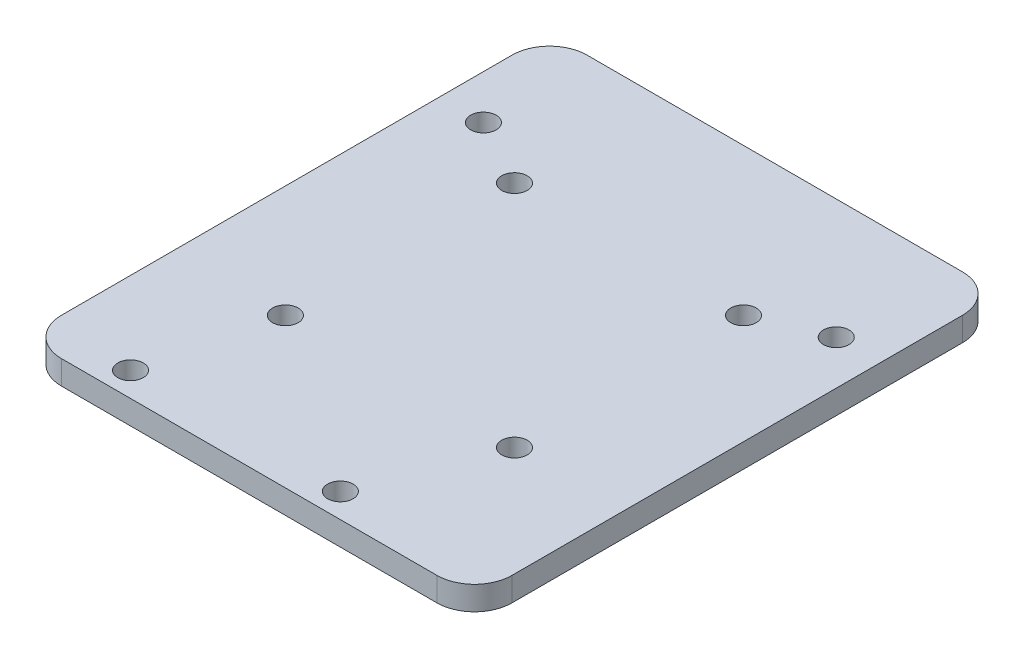
ISO-10303-21;
HEADER;
FILE_DESCRIPTION(('STEP AP214'),'2;1');
FILE_NAME('part.step','',(''),(''),'','','');
FILE_SCHEMA(('AUTOMOTIVE_DESIGN { 1 0 10303 214 1 1 1 1 }'));
ENDSEC;
DATA;
#1=APPLICATION_CONTEXT('core data for automotive mechanical design processes');
#2=APPLICATION_PROTOCOL_DEFINITION('international standard','automotive_design',2000,#1);
#3=PRODUCT_CONTEXT('',#1,'mechanical');
#4=PRODUCT('Part','Part','',(#3));
#5=PRODUCT_RELATED_PRODUCT_CATEGORY('part','',(#4));
#6=PRODUCT_DEFINITION_FORMATION('','',#4);
#7=PRODUCT_DEFINITION_CONTEXT('part definition',#1,'design');
#8=PRODUCT_DEFINITION('design','',#6,#7);
#9=PRODUCT_DEFINITION_SHAPE('','',#8);
#10=(LENGTH_UNIT() NAMED_UNIT(*) SI_UNIT(.MILLI.,.METRE.));
#11=(NAMED_UNIT(*) PLANE_ANGLE_UNIT() SI_UNIT($,.RADIAN.));
#12=(NAMED_UNIT(*) SI_UNIT($,.STERADIAN.) SOLID_ANGLE_UNIT());
#13=UNCERTAINTY_MEASURE_WITH_UNIT(LENGTH_MEASURE(1.E-05),#10,'distance_accuracy_value','');
#14=(GEOMETRIC_REPRESENTATION_CONTEXT(3) GLOBAL_UNCERTAINTY_ASSIGNED_CONTEXT((#13)) GLOBAL_UNIT_ASSIGNED_CONTEXT((#10,
#11,#12)) REPRESENTATION_CONTEXT('',''));
#15=CARTESIAN_POINT('',(0.,0.,0.));
#16=DIRECTION('',(0.,0.,1.));
#17=DIRECTION('',(1.,0.,0.));
#18=AXIS2_PLACEMENT_3D('',#15,#16,#17);
#19=CARTESIAN_POINT('',(-30.,3.175,35.));
#20=DIRECTION('',(1.,0.,0.));
#21=DIRECTION('',(0.,0.,-1.));
#22=AXIS2_PLACEMENT_3D('',#19,#20,#21);
#23=PLANE('',#22);
#24=DIRECTION('',(0.,0.,1.));
#25=VECTOR('',#24,1.);
#26=CARTESIAN_POINT('',(-30.,3.175,35.));
#27=LINE('',#26,#25);
#28=CARTESIAN_POINT('',(-30.,3.175,-30.));
#29=VERTEX_POINT('',#28);
#30=CARTESIAN_POINT('',(-30.,3.175,30.));
#31=VERTEX_POINT('',#30);
#32=EDGE_CURVE('E118',#29,#31,#27,.T.);
#33=ORIENTED_EDGE('',*,*,#32,.F.);
#34=DIRECTION('',(0.,-1.,0.));
#35=VECTOR('',#34,1.);
#36=CARTESIAN_POINT('',(-30.,3.175,-30.));
#37=LINE('',#36,#35);
#38=CARTESIAN_POINT('',(-30.,0.,-30.));
#39=VERTEX_POINT('',#38);
#40=EDGE_CURVE('E103',#29,#39,#37,.T.);
#41=ORIENTED_EDGE('',*,*,#40,.T.);
#42=DIRECTION('',(0.,0.,1.));
#43=VECTOR('',#42,1.);
#44=CARTESIAN_POINT('',(-30.,0.,35.));
#45=LINE('',#44,#43);
#46=CARTESIAN_POINT('',(-30.,0.,30.));
#47=VERTEX_POINT('',#46);
#48=EDGE_CURVE('E115',#39,#47,#45,.T.);
#49=ORIENTED_EDGE('',*,*,#48,.T.);
#50=DIRECTION('',(0.,-1.,0.));
#51=VECTOR('',#50,1.);
#52=CARTESIAN_POINT('',(-30.,3.175,30.));
#53=LINE('',#52,#51);
#54=EDGE_CURVE('E120',#47,#31,#53,.F.);
#55=ORIENTED_EDGE('',*,*,#54,.T.);
#56=EDGE_LOOP('',(#33,#41,#49,#55));
#57=FACE_BOUND('',#56,.T.);
#58=ADVANCED_FACE('F33',(#57),#23,.F.);
#59=CARTESIAN_POINT('',(30.,3.175,35.));
#60=DIRECTION('',(0.,0.,-1.));
#61=DIRECTION('',(-1.,0.,0.));
#62=AXIS2_PLACEMENT_3D('',#59,#60,#61);
#63=PLANE('',#62);
#64=DIRECTION('',(1.,0.,0.));
#65=VECTOR('',#64,1.);
#66=CARTESIAN_POINT('',(30.,0.,35.));
#67=LINE('',#66,#65);
#68=CARTESIAN_POINT('',(-25.,0.,35.));
#69=VERTEX_POINT('',#68);
#70=CARTESIAN_POINT('',(25.,0.,35.));
#71=VERTEX_POINT('',#70);
#72=EDGE_CURVE('E124',#69,#71,#67,.T.);
#73=ORIENTED_EDGE('',*,*,#72,.T.);
#74=DIRECTION('',(0.,-1.,0.));
#75=VECTOR('',#74,1.);
#76=CARTESIAN_POINT('',(25.,3.175,35.));
#77=LINE('',#76,#75);
#78=CARTESIAN_POINT('',(25.,3.175,35.));
#79=VERTEX_POINT('',#78);
#80=EDGE_CURVE('E11',#71,#79,#77,.F.);
#81=ORIENTED_EDGE('',*,*,#80,.T.);
#82=DIRECTION('',(1.,0.,0.));
#83=VECTOR('',#82,1.);
#84=CARTESIAN_POINT('',(30.,3.175,35.));
#85=LINE('',#84,#83);
#86=CARTESIAN_POINT('',(-25.,3.175,35.));
#87=VERTEX_POINT('',#86);
#88=EDGE_CURVE('E164',#87,#79,#85,.T.);
#89=ORIENTED_EDGE('',*,*,#88,.F.);
#90=DIRECTION('',(0.,-1.,0.));
#91=VECTOR('',#90,1.);
#92=CARTESIAN_POINT('',(-25.,3.175,35.));
#93=LINE('',#92,#91);
#94=EDGE_CURVE('E41',#87,#69,#93,.T.);
#95=ORIENTED_EDGE('',*,*,#94,.T.);
#96=EDGE_LOOP('',(#73,#81,#89,#95));
#97=FACE_BOUND('',#96,.T.);
#98=ADVANCED_FACE('F162',(#97),#63,.F.);
#99=CARTESIAN_POINT('',(30.,3.175,35.));
#100=DIRECTION('',(-1.,0.,0.));
#101=DIRECTION('',(0.,0.,1.));
#102=AXIS2_PLACEMENT_3D('',#99,#100,#101);
#103=PLANE('',#102);
#104=DIRECTION('',(0.,0.,-1.));
#105=VECTOR('',#104,1.);
#106=CARTESIAN_POINT('',(30.,0.,35.));
#107=LINE('',#106,#105);
#108=CARTESIAN_POINT('',(30.,0.,30.));
#109=VERTEX_POINT('',#108);
#110=CARTESIAN_POINT('',(30.,0.,-30.));
#111=VERTEX_POINT('',#110);
#112=EDGE_CURVE('E128',#109,#111,#107,.T.);
#113=ORIENTED_EDGE('',*,*,#112,.T.);
#114=DIRECTION('',(0.,-1.,0.));
#115=VECTOR('',#114,1.);
#116=CARTESIAN_POINT('',(30.,3.175,-30.));
#117=LINE('',#116,#115);
#118=CARTESIAN_POINT('',(30.,3.175,-30.));
#119=VERTEX_POINT('',#118);
#120=EDGE_CURVE('E48',#111,#119,#117,.F.);
#121=ORIENTED_EDGE('',*,*,#120,.T.);
#122=DIRECTION('',(0.,0.,-1.));
#123=VECTOR('',#122,1.);
#124=CARTESIAN_POINT('',(30.,3.175,35.));
#125=LINE('',#124,#123);
#126=CARTESIAN_POINT('',(30.,3.175,30.));
#127=VERTEX_POINT('',#126);
#128=EDGE_CURVE('E172',#127,#119,#125,.T.);
#129=ORIENTED_EDGE('',*,*,#128,.F.);
#130=DIRECTION('',(0.,-1.,0.));
#131=VECTOR('',#130,1.);
#132=CARTESIAN_POINT('',(30.,3.175,30.));
#133=LINE('',#132,#131);
#134=EDGE_CURVE('E155',#127,#109,#133,.T.);
#135=ORIENTED_EDGE('',*,*,#134,.T.);
#136=EDGE_LOOP('',(#113,#121,#129,#135));
#137=FACE_BOUND('',#136,.T.);
#138=ADVANCED_FACE('F171',(#137),#103,.F.);
#139=CARTESIAN_POINT('',(30.,3.175,-35.));
#140=DIRECTION('',(0.,0.,1.));
#141=DIRECTION('',(1.,0.,0.));
#142=AXIS2_PLACEMENT_3D('',#139,#140,#141);
#143=PLANE('',#142);
#144=DIRECTION('',(-1.,0.,0.));
#145=VECTOR('',#144,1.);
#146=CARTESIAN_POINT('',(30.,0.,-35.));
#147=LINE('',#146,#145);
#148=CARTESIAN_POINT('',(25.,0.,-35.));
#149=VERTEX_POINT('',#148);
#150=CARTESIAN_POINT('',(-25.,0.,-35.));
#151=VERTEX_POINT('',#150);
#152=EDGE_CURVE('E138',#149,#151,#147,.T.);
#153=ORIENTED_EDGE('',*,*,#152,.T.);
#154=DIRECTION('',(0.,-1.,0.));
#155=VECTOR('',#154,1.);
#156=CARTESIAN_POINT('',(-25.,3.175,-35.));
#157=LINE('',#156,#155);
#158=CARTESIAN_POINT('',(-25.,3.175,-35.));
#159=VERTEX_POINT('',#158);
#160=EDGE_CURVE('E104',#151,#159,#157,.F.);
#161=ORIENTED_EDGE('',*,*,#160,.T.);
#162=DIRECTION('',(-1.,0.,0.));
#163=VECTOR('',#162,1.);
#164=CARTESIAN_POINT('',(30.,3.175,-35.));
#165=LINE('',#164,#163);
#166=CARTESIAN_POINT('',(25.,3.175,-35.));
#167=VERTEX_POINT('',#166);
#168=EDGE_CURVE('E134',#167,#159,#165,.T.);
#169=ORIENTED_EDGE('',*,*,#168,.F.);
#170=DIRECTION('',(0.,-1.,0.));
#171=VECTOR('',#170,1.);
#172=CARTESIAN_POINT('',(25.,3.175,-35.));
#173=LINE('',#172,#171);
#174=EDGE_CURVE('E109',#167,#149,#173,.T.);
#175=ORIENTED_EDGE('',*,*,#174,.T.);
#176=EDGE_LOOP('',(#153,#161,#169,#175));
#177=FACE_BOUND('',#176,.T.);
#178=ADVANCED_FACE('F228',(#177),#143,.F.);
#179=CARTESIAN_POINT('',(0.,3.175,0.));
#180=DIRECTION('',(0.,1.,0.));
#181=DIRECTION('',(0.,0.,1.));
#182=AXIS2_PLACEMENT_3D('',#179,#180,#181);
#183=PLANE('',#182);
#184=CARTESIAN_POINT('',(-19.05,3.175,31.75));
#185=DIRECTION('',(0.,1.,0.));
#186=DIRECTION('',(0.,0.,1.));
#187=AXIS2_PLACEMENT_3D('',#184,#185,#186);
#188=CIRCLE('',#187,1.69999999999999);
#189=CARTESIAN_POINT('',(-19.05,3.175,33.45));
#190=VERTEX_POINT('',#189);
#191=EDGE_CURVE('E219',#190,#190,#188,.T.);
#192=ORIENTED_EDGE('',*,*,#191,.F.);
#193=EDGE_LOOP('',(#192));
#194=FACE_BOUND('',#193,.T.);
#195=CARTESIAN_POINT('',(8.88999999999998,3.175,31.75));
#196=DIRECTION('',(0.,1.,0.));
#197=DIRECTION('',(0.,0.,1.));
#198=AXIS2_PLACEMENT_3D('',#195,#196,#197);
#199=CIRCLE('',#198,1.69999999999999);
#200=CARTESIAN_POINT('',(8.88999999999998,3.175,33.45));
#201=VERTEX_POINT('',#200);
#202=EDGE_CURVE('E213',#201,#201,#199,.T.);
#203=ORIENTED_EDGE('',*,*,#202,.F.);
#204=EDGE_LOOP('',(#203));
#205=FACE_BOUND('',#204,.T.);
#206=CARTESIAN_POINT('',(24.13,3.175,-19.05));
#207=DIRECTION('',(0.,1.,0.));
#208=DIRECTION('',(0.,0.,1.));
#209=AXIS2_PLACEMENT_3D('',#206,#207,#208);
#210=CIRCLE('',#209,1.69999999999999);
#211=CARTESIAN_POINT('',(24.13,3.175,-17.35));
#212=VERTEX_POINT('',#211);
#213=EDGE_CURVE('E207',#212,#212,#210,.T.);
#214=ORIENTED_EDGE('',*,*,#213,.F.);
#215=EDGE_LOOP('',(#214));
#216=FACE_BOUND('',#215,.T.);
#217=CARTESIAN_POINT('',(-24.13,3.175,-20.32));
#218=DIRECTION('',(0.,1.,0.));
#219=DIRECTION('',(0.,0.,1.));
#220=AXIS2_PLACEMENT_3D('',#217,#218,#219);
#221=CIRCLE('',#220,1.69999999999999);
#222=CARTESIAN_POINT('',(-24.13,3.175,-18.62));
#223=VERTEX_POINT('',#222);
#224=EDGE_CURVE('E201',#223,#223,#221,.T.);
#225=ORIENTED_EDGE('',*,*,#224,.F.);
#226=EDGE_LOOP('',(#225));
#227=FACE_BOUND('',#226,.T.);
#228=CARTESIAN_POINT('',(15.4254185977343,3.175,-15.4016660563837));
#229=DIRECTION('',(0.,1.,0.));
#230=DIRECTION('',(0.,0.,1.));
#231=AXIS2_PLACEMENT_3D('',#228,#229,#230);
#232=CIRCLE('',#231,1.69999999999999);
#233=CARTESIAN_POINT('',(15.4254185977343,3.175,-13.7016660563837));
#234=VERTEX_POINT('',#233);
#235=EDGE_CURVE('E195',#234,#234,#232,.T.);
#236=ORIENTED_EDGE('',*,*,#235,.F.);
#237=EDGE_LOOP('',(#236));
#238=FACE_BOUND('',#237,.T.);
#239=CARTESIAN_POINT('',(15.4254185977343,3.175,15.0983339436163));
#240=DIRECTION('',(0.,1.,0.));
#241=DIRECTION('',(0.,0.,1.));
#242=AXIS2_PLACEMENT_3D('',#239,#240,#241);
#243=CIRCLE('',#242,1.69999999999999);
#244=CARTESIAN_POINT('',(15.4254185977343,3.175,16.7983339436163));
#245=VERTEX_POINT('',#244);
#246=EDGE_CURVE('E189',#245,#245,#243,.T.);
#247=ORIENTED_EDGE('',*,*,#246,.F.);
#248=EDGE_LOOP('',(#247));
#249=FACE_BOUND('',#248,.T.);
#250=CARTESIAN_POINT('',(-15.0745814022657,3.175,15.0983339436163));
#251=DIRECTION('',(0.,1.,0.));
#252=DIRECTION('',(0.,0.,1.));
#253=AXIS2_PLACEMENT_3D('',#250,#251,#252);
#254=CIRCLE('',#253,1.69999999999999);
#255=CARTESIAN_POINT('',(-15.0745814022657,3.175,16.7983339436163));
#256=VERTEX_POINT('',#255);
#257=EDGE_CURVE('E183',#256,#256,#254,.T.);
#258=ORIENTED_EDGE('',*,*,#257,.F.);
#259=EDGE_LOOP('',(#258));
#260=FACE_BOUND('',#259,.T.);
#261=CARTESIAN_POINT('',(-15.0745814022658,3.175,-15.4016660563835));
#262=DIRECTION('',(0.,1.,0.));
#263=DIRECTION('',(0.,0.,1.));
#264=AXIS2_PLACEMENT_3D('',#261,#262,#263);
#265=CIRCLE('',#264,1.69999999999999);
#266=CARTESIAN_POINT('',(-15.0745814022658,3.175,-13.7016660563835));
#267=VERTEX_POINT('',#266);
#268=EDGE_CURVE('E131',#267,#267,#265,.T.);
#269=ORIENTED_EDGE('',*,*,#268,.F.);
#270=EDGE_LOOP('',(#269));
#271=FACE_BOUND('',#270,.T.);
#272=ORIENTED_EDGE('',*,*,#168,.T.);
#273=CARTESIAN_POINT('',(-25.,3.175,-30.));
#274=DIRECTION('',(0.,1.,0.));
#275=DIRECTION('',(0.,0.,1.));
#276=AXIS2_PLACEMENT_3D('',#273,#274,#275);
#277=CIRCLE('',#276,5.);
#278=EDGE_CURVE('E153',#159,#29,#277,.T.);
#279=ORIENTED_EDGE('',*,*,#278,.T.);
#280=ORIENTED_EDGE('',*,*,#32,.T.);
#281=CARTESIAN_POINT('',(-25.,3.175,30.));
#282=DIRECTION('',(0.,1.,0.));
#283=DIRECTION('',(0.,0.,1.));
#284=AXIS2_PLACEMENT_3D('',#281,#282,#283);
#285=CIRCLE('',#284,5.);
#286=EDGE_CURVE('E148',#31,#87,#285,.T.);
#287=ORIENTED_EDGE('',*,*,#286,.T.);
#288=ORIENTED_EDGE('',*,*,#88,.T.);
#289=CARTESIAN_POINT('',(25.,3.175,30.));
#290=DIRECTION('',(0.,1.,0.));
#291=DIRECTION('',(0.,0.,1.));
#292=AXIS2_PLACEMENT_3D('',#289,#290,#291);
#293=CIRCLE('',#292,5.);
#294=EDGE_CURVE('E55',#79,#127,#293,.T.);
#295=ORIENTED_EDGE('',*,*,#294,.T.);
#296=ORIENTED_EDGE('',*,*,#128,.T.);
#297=CARTESIAN_POINT('',(25.,3.175,-30.));
#298=DIRECTION('',(0.,1.,0.));
#299=DIRECTION('',(0.,0.,1.));
#300=AXIS2_PLACEMENT_3D('',#297,#298,#299);
#301=CIRCLE('',#300,5.);
#302=EDGE_CURVE('E151',#119,#167,#301,.T.);
#303=ORIENTED_EDGE('',*,*,#302,.T.);
#304=EDGE_LOOP('',(#272,#279,#280,#287,#288,#295,#296,#303));
#305=FACE_BOUND('',#304,.T.);
#306=ADVANCED_FACE('F225',(#194,#205,#216,#227,#238,#249,#260,#271,#305),#183,.T.);
#307=CARTESIAN_POINT('',(0.,0.,0.));
#308=DIRECTION('',(0.,1.,0.));
#309=DIRECTION('',(0.,0.,1.));
#310=AXIS2_PLACEMENT_3D('',#307,#308,#309);
#311=PLANE('',#310);
#312=CARTESIAN_POINT('',(-19.05,0.,31.75));
#313=DIRECTION('',(0.,1.,0.));
#314=DIRECTION('',(0.,0.,1.));
#315=AXIS2_PLACEMENT_3D('',#312,#313,#314);
#316=CIRCLE('',#315,1.7);
#317=CARTESIAN_POINT('',(-19.05,0.,33.45));
#318=VERTEX_POINT('',#317);
#319=EDGE_CURVE('E216',#318,#318,#316,.T.);
#320=ORIENTED_EDGE('',*,*,#319,.T.);
#321=EDGE_LOOP('',(#320));
#322=FACE_BOUND('',#321,.T.);
#323=CARTESIAN_POINT('',(8.88999999999998,0.,31.75));
#324=DIRECTION('',(0.,1.,0.));
#325=DIRECTION('',(0.,0.,1.));
#326=AXIS2_PLACEMENT_3D('',#323,#324,#325);
#327=CIRCLE('',#326,1.7);
#328=CARTESIAN_POINT('',(8.88999999999998,0.,33.45));
#329=VERTEX_POINT('',#328);
#330=EDGE_CURVE('E210',#329,#329,#327,.T.);
#331=ORIENTED_EDGE('',*,*,#330,.T.);
#332=EDGE_LOOP('',(#331));
#333=FACE_BOUND('',#332,.T.);
#334=CARTESIAN_POINT('',(24.13,0.,-19.05));
#335=DIRECTION('',(0.,1.,0.));
#336=DIRECTION('',(0.,0.,1.));
#337=AXIS2_PLACEMENT_3D('',#334,#335,#336);
#338=CIRCLE('',#337,1.7);
#339=CARTESIAN_POINT('',(24.13,0.,-17.35));
#340=VERTEX_POINT('',#339);
#341=EDGE_CURVE('E204',#340,#340,#338,.T.);
#342=ORIENTED_EDGE('',*,*,#341,.T.);
#343=EDGE_LOOP('',(#342));
#344=FACE_BOUND('',#343,.T.);
#345=CARTESIAN_POINT('',(-24.13,0.,-20.32));
#346=DIRECTION('',(0.,1.,0.));
#347=DIRECTION('',(0.,0.,1.));
#348=AXIS2_PLACEMENT_3D('',#345,#346,#347);
#349=CIRCLE('',#348,1.7);
#350=CARTESIAN_POINT('',(-24.13,0.,-18.62));
#351=VERTEX_POINT('',#350);
#352=EDGE_CURVE('E198',#351,#351,#349,.T.);
#353=ORIENTED_EDGE('',*,*,#352,.T.);
#354=EDGE_LOOP('',(#353));
#355=FACE_BOUND('',#354,.T.);
#356=CARTESIAN_POINT('',(15.4254185977343,0.,-15.4016660563837));
#357=DIRECTION('',(0.,1.,0.));
#358=DIRECTION('',(0.,0.,1.));
#359=AXIS2_PLACEMENT_3D('',#356,#357,#358);
#360=CIRCLE('',#359,1.7);
#361=CARTESIAN_POINT('',(15.4254185977343,0.,-13.7016660563837));
#362=VERTEX_POINT('',#361);
#363=EDGE_CURVE('E192',#362,#362,#360,.T.);
#364=ORIENTED_EDGE('',*,*,#363,.T.);
#365=EDGE_LOOP('',(#364));
#366=FACE_BOUND('',#365,.T.);
#367=CARTESIAN_POINT('',(15.4254185977343,0.,15.0983339436163));
#368=DIRECTION('',(0.,1.,0.));
#369=DIRECTION('',(0.,0.,1.));
#370=AXIS2_PLACEMENT_3D('',#367,#368,#369);
#371=CIRCLE('',#370,1.7);
#372=CARTESIAN_POINT('',(15.4254185977343,0.,16.7983339436163));
#373=VERTEX_POINT('',#372);
#374=EDGE_CURVE('E186',#373,#373,#371,.T.);
#375=ORIENTED_EDGE('',*,*,#374,.T.);
#376=EDGE_LOOP('',(#375));
#377=FACE_BOUND('',#376,.T.);
#378=CARTESIAN_POINT('',(-15.0745814022657,0.,15.0983339436163));
#379=DIRECTION('',(0.,1.,0.));
#380=DIRECTION('',(0.,0.,1.));
#381=AXIS2_PLACEMENT_3D('',#378,#379,#380);
#382=CIRCLE('',#381,1.7);
#383=CARTESIAN_POINT('',(-15.0745814022657,0.,16.7983339436163));
#384=VERTEX_POINT('',#383);
#385=EDGE_CURVE('E180',#384,#384,#382,.T.);
#386=ORIENTED_EDGE('',*,*,#385,.T.);
#387=EDGE_LOOP('',(#386));
#388=FACE_BOUND('',#387,.T.);
#389=CARTESIAN_POINT('',(-15.0745814022658,0.,-15.4016660563835));
#390=DIRECTION('',(0.,1.,0.));
#391=DIRECTION('',(0.,0.,1.));
#392=AXIS2_PLACEMENT_3D('',#389,#390,#391);
#393=CIRCLE('',#392,1.7);
#394=CARTESIAN_POINT('',(-15.0745814022658,0.,-13.7016660563835));
#395=VERTEX_POINT('',#394);
#396=EDGE_CURVE('E125',#395,#395,#393,.T.);
#397=ORIENTED_EDGE('',*,*,#396,.T.);
#398=EDGE_LOOP('',(#397));
#399=FACE_BOUND('',#398,.T.);
#400=ORIENTED_EDGE('',*,*,#48,.F.);
#401=CARTESIAN_POINT('',(-25.,0.,-30.));
#402=DIRECTION('',(0.,1.,0.));
#403=DIRECTION('',(0.,0.,1.));
#404=AXIS2_PLACEMENT_3D('',#401,#402,#403);
#405=CIRCLE('',#404,5.);
#406=EDGE_CURVE('E99',#39,#151,#405,.F.);
#407=ORIENTED_EDGE('',*,*,#406,.T.);
#408=ORIENTED_EDGE('',*,*,#152,.F.);
#409=CARTESIAN_POINT('',(25.,0.,-30.));
#410=DIRECTION('',(0.,1.,0.));
#411=DIRECTION('',(0.,0.,1.));
#412=AXIS2_PLACEMENT_3D('',#409,#410,#411);
#413=CIRCLE('',#412,5.);
#414=EDGE_CURVE('E110',#149,#111,#413,.F.);
#415=ORIENTED_EDGE('',*,*,#414,.T.);
#416=ORIENTED_EDGE('',*,*,#112,.F.);
#417=CARTESIAN_POINT('',(25.,0.,30.));
#418=DIRECTION('',(0.,1.,0.));
#419=DIRECTION('',(0.,0.,1.));
#420=AXIS2_PLACEMENT_3D('',#417,#418,#419);
#421=CIRCLE('',#420,5.);
#422=EDGE_CURVE('E142',#109,#71,#421,.F.);
#423=ORIENTED_EDGE('',*,*,#422,.T.);
#424=ORIENTED_EDGE('',*,*,#72,.F.);
#425=CARTESIAN_POINT('',(-25.,0.,30.));
#426=DIRECTION('',(0.,1.,0.));
#427=DIRECTION('',(0.,0.,1.));
#428=AXIS2_PLACEMENT_3D('',#425,#426,#427);
#429=CIRCLE('',#428,5.);
#430=EDGE_CURVE('E119',#69,#47,#429,.F.);
#431=ORIENTED_EDGE('',*,*,#430,.T.);
#432=EDGE_LOOP('',(#400,#407,#408,#415,#416,#423,#424,#431));
#433=FACE_BOUND('',#432,.T.);
#434=ADVANCED_FACE('F122',(#322,#333,#344,#355,#366,#377,#388,#399,#433),#311,.F.);
#435=CARTESIAN_POINT('',(-15.0745814022658,3.175,-15.4016660563835));
#436=DIRECTION('',(0.,1.,0.));
#437=DIRECTION('',(0.,0.,1.));
#438=AXIS2_PLACEMENT_3D('',#435,#436,#437);
#439=CYLINDRICAL_SURFACE('',#438,1.69999999999999);
#440=ORIENTED_EDGE('',*,*,#396,.F.);
#441=EDGE_LOOP('',(#440));
#442=FACE_BOUND('',#441,.T.);
#443=ORIENTED_EDGE('',*,*,#268,.T.);
#444=EDGE_LOOP('',(#443));
#445=FACE_BOUND('',#444,.T.);
#446=ADVANCED_FACE('F267',(#442,#445),#439,.F.);
#447=CARTESIAN_POINT('',(-15.0745814022657,3.175,15.0983339436163));
#448=DIRECTION('',(0.,1.,0.));
#449=DIRECTION('',(0.,0.,1.));
#450=AXIS2_PLACEMENT_3D('',#447,#448,#449);
#451=CYLINDRICAL_SURFACE('',#450,1.69999999999999);
#452=ORIENTED_EDGE('',*,*,#385,.F.);
#453=EDGE_LOOP('',(#452));
#454=FACE_BOUND('',#453,.T.);
#455=ORIENTED_EDGE('',*,*,#257,.T.);
#456=EDGE_LOOP('',(#455));
#457=FACE_BOUND('',#456,.T.);
#458=ADVANCED_FACE('F272',(#454,#457),#451,.F.);
#459=CARTESIAN_POINT('',(15.4254185977343,3.175,15.0983339436163));
#460=DIRECTION('',(0.,1.,0.));
#461=DIRECTION('',(0.,0.,1.));
#462=AXIS2_PLACEMENT_3D('',#459,#460,#461);
#463=CYLINDRICAL_SURFACE('',#462,1.69999999999999);
#464=ORIENTED_EDGE('',*,*,#374,.F.);
#465=EDGE_LOOP('',(#464));
#466=FACE_BOUND('',#465,.T.);
#467=ORIENTED_EDGE('',*,*,#246,.T.);
#468=EDGE_LOOP('',(#467));
#469=FACE_BOUND('',#468,.T.);
#470=ADVANCED_FACE('F276',(#466,#469),#463,.F.);
#471=CARTESIAN_POINT('',(15.4254185977343,3.175,-15.4016660563837));
#472=DIRECTION('',(0.,1.,0.));
#473=DIRECTION('',(0.,0.,1.));
#474=AXIS2_PLACEMENT_3D('',#471,#472,#473);
#475=CYLINDRICAL_SURFACE('',#474,1.69999999999999);
#476=ORIENTED_EDGE('',*,*,#363,.F.);
#477=EDGE_LOOP('',(#476));
#478=FACE_BOUND('',#477,.T.);
#479=ORIENTED_EDGE('',*,*,#235,.T.);
#480=EDGE_LOOP('',(#479));
#481=FACE_BOUND('',#480,.T.);
#482=ADVANCED_FACE('F280',(#478,#481),#475,.F.);
#483=CARTESIAN_POINT('',(-24.13,3.175,-20.32));
#484=DIRECTION('',(0.,1.,0.));
#485=DIRECTION('',(0.,0.,1.));
#486=AXIS2_PLACEMENT_3D('',#483,#484,#485);
#487=CYLINDRICAL_SURFACE('',#486,1.69999999999999);
#488=ORIENTED_EDGE('',*,*,#352,.F.);
#489=EDGE_LOOP('',(#488));
#490=FACE_BOUND('',#489,.T.);
#491=ORIENTED_EDGE('',*,*,#224,.T.);
#492=EDGE_LOOP('',(#491));
#493=FACE_BOUND('',#492,.T.);
#494=ADVANCED_FACE('F284',(#490,#493),#487,.F.);
#495=CARTESIAN_POINT('',(24.13,3.175,-19.05));
#496=DIRECTION('',(0.,1.,0.));
#497=DIRECTION('',(0.,0.,1.));
#498=AXIS2_PLACEMENT_3D('',#495,#496,#497);
#499=CYLINDRICAL_SURFACE('',#498,1.69999999999999);
#500=ORIENTED_EDGE('',*,*,#341,.F.);
#501=EDGE_LOOP('',(#500));
#502=FACE_BOUND('',#501,.T.);
#503=ORIENTED_EDGE('',*,*,#213,.T.);
#504=EDGE_LOOP('',(#503));
#505=FACE_BOUND('',#504,.T.);
#506=ADVANCED_FACE('F288',(#502,#505),#499,.F.);
#507=CARTESIAN_POINT('',(8.88999999999998,3.175,31.75));
#508=DIRECTION('',(0.,1.,0.));
#509=DIRECTION('',(0.,0.,1.));
#510=AXIS2_PLACEMENT_3D('',#507,#508,#509);
#511=CYLINDRICAL_SURFACE('',#510,1.69999999999999);
#512=ORIENTED_EDGE('',*,*,#330,.F.);
#513=EDGE_LOOP('',(#512));
#514=FACE_BOUND('',#513,.T.);
#515=ORIENTED_EDGE('',*,*,#202,.T.);
#516=EDGE_LOOP('',(#515));
#517=FACE_BOUND('',#516,.T.);
#518=ADVANCED_FACE('F292',(#514,#517),#511,.F.);
#519=CARTESIAN_POINT('',(-19.05,3.175,31.75));
#520=DIRECTION('',(0.,1.,0.));
#521=DIRECTION('',(0.,0.,1.));
#522=AXIS2_PLACEMENT_3D('',#519,#520,#521);
#523=CYLINDRICAL_SURFACE('',#522,1.69999999999999);
#524=ORIENTED_EDGE('',*,*,#319,.F.);
#525=EDGE_LOOP('',(#524));
#526=FACE_BOUND('',#525,.T.);
#527=ORIENTED_EDGE('',*,*,#191,.T.);
#528=EDGE_LOOP('',(#527));
#529=FACE_BOUND('',#528,.T.);
#530=ADVANCED_FACE('F223',(#526,#529),#523,.F.);
#531=CARTESIAN_POINT('',(-25.,3.175,-30.));
#532=DIRECTION('',(0.,-1.,0.));
#533=DIRECTION('',(0.,0.,-1.));
#534=AXIS2_PLACEMENT_3D('',#531,#532,#533);
#535=CYLINDRICAL_SURFACE('',#534,5.);
#536=ORIENTED_EDGE('',*,*,#278,.F.);
#537=ORIENTED_EDGE('',*,*,#160,.F.);
#538=ORIENTED_EDGE('',*,*,#406,.F.);
#539=ORIENTED_EDGE('',*,*,#40,.F.);
#540=EDGE_LOOP('',(#536,#537,#538,#539));
#541=FACE_BOUND('',#540,.T.);
#542=ADVANCED_FACE('F102',(#541),#535,.T.);
#543=CARTESIAN_POINT('',(25.,3.175,-30.));
#544=DIRECTION('',(0.,-1.,0.));
#545=DIRECTION('',(0.,0.,-1.));
#546=AXIS2_PLACEMENT_3D('',#543,#544,#545);
#547=CYLINDRICAL_SURFACE('',#546,5.);
#548=ORIENTED_EDGE('',*,*,#302,.F.);
#549=ORIENTED_EDGE('',*,*,#120,.F.);
#550=ORIENTED_EDGE('',*,*,#414,.F.);
#551=ORIENTED_EDGE('',*,*,#174,.F.);
#552=EDGE_LOOP('',(#548,#549,#550,#551));
#553=FACE_BOUND('',#552,.T.);
#554=ADVANCED_FACE('F247',(#553),#547,.T.);
#555=CARTESIAN_POINT('',(25.,3.175,30.));
#556=DIRECTION('',(0.,-1.,0.));
#557=DIRECTION('',(0.,0.,-1.));
#558=AXIS2_PLACEMENT_3D('',#555,#556,#557);
#559=CYLINDRICAL_SURFACE('',#558,5.);
#560=ORIENTED_EDGE('',*,*,#294,.F.);
#561=ORIENTED_EDGE('',*,*,#80,.F.);
#562=ORIENTED_EDGE('',*,*,#422,.F.);
#563=ORIENTED_EDGE('',*,*,#134,.F.);
#564=EDGE_LOOP('',(#560,#561,#562,#563));
#565=FACE_BOUND('',#564,.T.);
#566=ADVANCED_FACE('F170',(#565),#559,.T.);
#567=CARTESIAN_POINT('',(-25.,3.175,30.));
#568=DIRECTION('',(0.,-1.,0.));
#569=DIRECTION('',(0.,0.,-1.));
#570=AXIS2_PLACEMENT_3D('',#567,#568,#569);
#571=CYLINDRICAL_SURFACE('',#570,5.);
#572=ORIENTED_EDGE('',*,*,#286,.F.);
#573=ORIENTED_EDGE('',*,*,#54,.F.);
#574=ORIENTED_EDGE('',*,*,#430,.F.);
#575=ORIENTED_EDGE('',*,*,#94,.F.);
#576=EDGE_LOOP('',(#572,#573,#574,#575));
#577=FACE_BOUND('',#576,.T.);
#578=ADVANCED_FACE('F35',(#577),#571,.T.);
#579=CLOSED_SHELL('',(#58,#98,#138,#178,#306,#434,#446,#458,#470,#482,#494,#506,#518,#530,#542,
#554,#566,#578));
#580=MANIFOLD_SOLID_BREP('B2',#579);
#581=ADVANCED_BREP_SHAPE_REPRESENTATION('',(#18,#580),#14);
#582=SHAPE_DEFINITION_REPRESENTATION(#9,#581);
ENDSEC;
END-ISO-10303-21;
